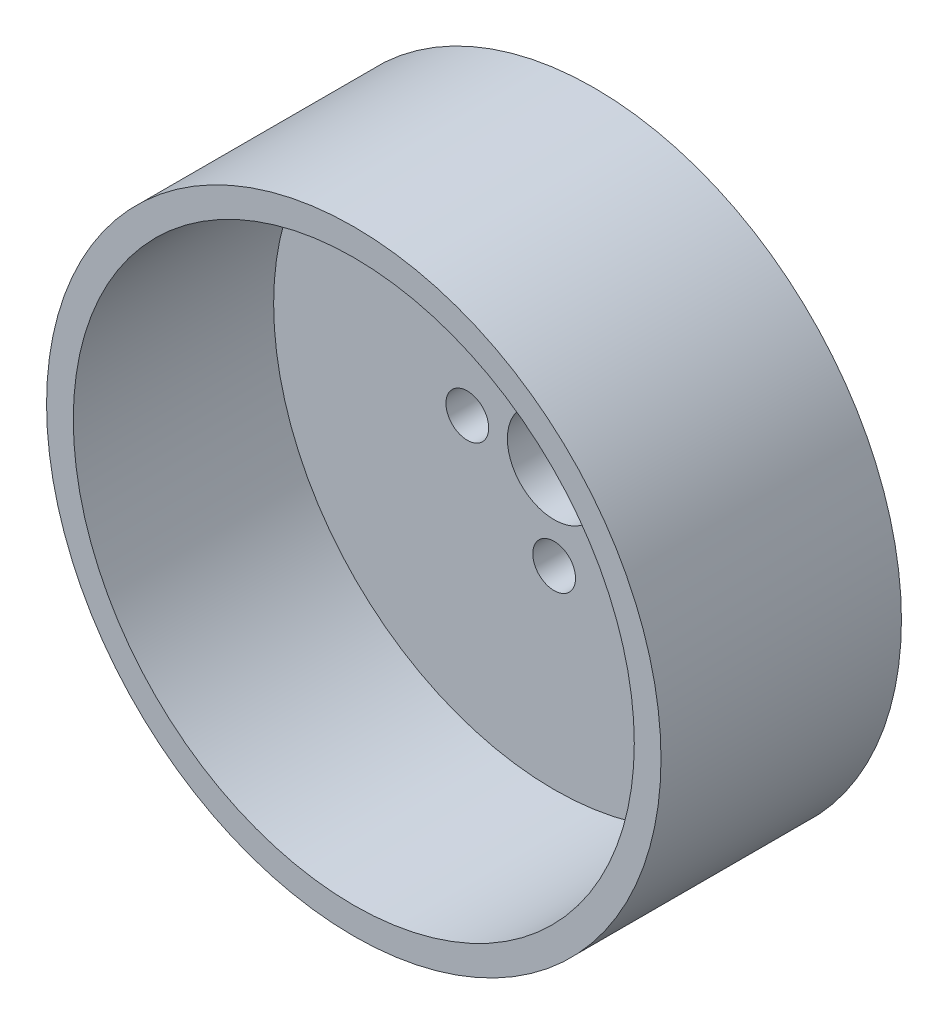
ISO-10303-21;
HEADER;
FILE_DESCRIPTION(('STEP AP214'),'2;1');
FILE_NAME('part.step','',(''),(''),'','','');
FILE_SCHEMA(('AUTOMOTIVE_DESIGN { 1 0 10303 214 1 1 1 1 }'));
ENDSEC;
DATA;
#1=APPLICATION_CONTEXT('core data for automotive mechanical design processes');
#2=APPLICATION_PROTOCOL_DEFINITION('international standard','automotive_design',2000,#1);
#3=PRODUCT_CONTEXT('',#1,'mechanical');
#4=PRODUCT('Part','Part','',(#3));
#5=PRODUCT_RELATED_PRODUCT_CATEGORY('part','',(#4));
#6=PRODUCT_DEFINITION_FORMATION('','',#4);
#7=PRODUCT_DEFINITION_CONTEXT('part definition',#1,'design');
#8=PRODUCT_DEFINITION('design','',#6,#7);
#9=PRODUCT_DEFINITION_SHAPE('','',#8);
#10=(LENGTH_UNIT() NAMED_UNIT(*) SI_UNIT(.MILLI.,.METRE.));
#11=(NAMED_UNIT(*) PLANE_ANGLE_UNIT() SI_UNIT($,.RADIAN.));
#12=(NAMED_UNIT(*) SI_UNIT($,.STERADIAN.) SOLID_ANGLE_UNIT());
#13=UNCERTAINTY_MEASURE_WITH_UNIT(LENGTH_MEASURE(1.E-05),#10,'distance_accuracy_value','');
#14=(GEOMETRIC_REPRESENTATION_CONTEXT(3) GLOBAL_UNCERTAINTY_ASSIGNED_CONTEXT((#13)) GLOBAL_UNIT_ASSIGNED_CONTEXT((#10,
#11,#12)) REPRESENTATION_CONTEXT('',''));
#15=CARTESIAN_POINT('',(0.,0.,0.));
#16=DIRECTION('',(0.,0.,1.));
#17=DIRECTION('',(1.,0.,0.));
#18=AXIS2_PLACEMENT_3D('',#15,#16,#17);
#19=CARTESIAN_POINT('',(0.,0.,0.));
#20=DIRECTION('',(0.,0.,-1.));
#21=DIRECTION('',(-1.,0.,0.));
#22=AXIS2_PLACEMENT_3D('',#19,#20,#21);
#23=CYLINDRICAL_SURFACE('',#22,3.5);
#24=CARTESIAN_POINT('',(0.,0.,0.));
#25=DIRECTION('',(0.,0.,-1.));
#26=DIRECTION('',(-1.,0.,0.));
#27=AXIS2_PLACEMENT_3D('',#24,#25,#26);
#28=CIRCLE('',#27,3.5);
#29=CARTESIAN_POINT('',(-3.5,0.,0.));
#30=VERTEX_POINT('',#29);
#31=EDGE_CURVE('E10',#30,#30,#28,.T.);
#32=ORIENTED_EDGE('',*,*,#31,.T.);
#33=EDGE_LOOP('',(#32));
#34=FACE_BOUND('',#33,.T.);
#35=CARTESIAN_POINT('',(0.,0.,3.));
#36=DIRECTION('',(0.,0.,-1.));
#37=DIRECTION('',(-1.,0.,0.));
#38=AXIS2_PLACEMENT_3D('',#35,#36,#37);
#39=CIRCLE('',#38,3.5);
#40=CARTESIAN_POINT('',(-3.5,0.,3.));
#41=VERTEX_POINT('',#40);
#42=EDGE_CURVE('E64',#41,#41,#39,.T.);
#43=ORIENTED_EDGE('',*,*,#42,.F.);
#44=EDGE_LOOP('',(#43));
#45=FACE_BOUND('',#44,.T.);
#46=ADVANCED_FACE('F37',(#34,#45),#23,.F.);
#47=CARTESIAN_POINT('',(-3.5,0.,0.));
#48=DIRECTION('',(0.,0.,-1.));
#49=DIRECTION('',(-1.,0.,0.));
#50=AXIS2_PLACEMENT_3D('',#47,#48,#49);
#51=PLANE('',#50);
#52=CARTESIAN_POINT('',(-6.5,0.,0.));
#53=DIRECTION('',(0.,0.,-1.));
#54=DIRECTION('',(-1.,0.,0.));
#55=AXIS2_PLACEMENT_3D('',#52,#53,#54);
#56=CIRCLE('',#55,1.6);
#57=CARTESIAN_POINT('',(-8.1,0.,0.));
#58=VERTEX_POINT('',#57);
#59=EDGE_CURVE('E57',#58,#58,#56,.T.);
#60=ORIENTED_EDGE('',*,*,#59,.F.);
#61=EDGE_LOOP('',(#60));
#62=FACE_BOUND('',#61,.T.);
#63=CARTESIAN_POINT('',(0.,-6.5,0.));
#64=DIRECTION('',(0.,0.,-1.));
#65=DIRECTION('',(-1.,0.,0.));
#66=AXIS2_PLACEMENT_3D('',#63,#64,#65);
#67=CIRCLE('',#66,1.6);
#68=CARTESIAN_POINT('',(-1.59999999999998,-6.5,0.));
#69=VERTEX_POINT('',#68);
#70=EDGE_CURVE('E115',#69,#69,#67,.T.);
#71=ORIENTED_EDGE('',*,*,#70,.F.);
#72=EDGE_LOOP('',(#71));
#73=FACE_BOUND('',#72,.T.);
#74=CARTESIAN_POINT('',(6.5,0.,0.));
#75=DIRECTION('',(0.,0.,-1.));
#76=DIRECTION('',(-1.,0.,0.));
#77=AXIS2_PLACEMENT_3D('',#74,#75,#76);
#78=CIRCLE('',#77,1.6);
#79=CARTESIAN_POINT('',(4.9,0.,0.));
#80=VERTEX_POINT('',#79);
#81=EDGE_CURVE('E119',#80,#80,#78,.T.);
#82=ORIENTED_EDGE('',*,*,#81,.F.);
#83=EDGE_LOOP('',(#82));
#84=FACE_BOUND('',#83,.T.);
#85=CARTESIAN_POINT('',(0.,6.5,0.));
#86=DIRECTION('',(0.,0.,-1.));
#87=DIRECTION('',(-1.,0.,0.));
#88=AXIS2_PLACEMENT_3D('',#85,#86,#87);
#89=CIRCLE('',#88,1.6);
#90=CARTESIAN_POINT('',(-1.60000000000007,6.5,0.));
#91=VERTEX_POINT('',#90);
#92=EDGE_CURVE('E76',#91,#91,#89,.T.);
#93=ORIENTED_EDGE('',*,*,#92,.F.);
#94=EDGE_LOOP('',(#93));
#95=FACE_BOUND('',#94,.T.);
#96=CARTESIAN_POINT('',(0.,0.,0.));
#97=DIRECTION('',(0.,0.,-1.));
#98=DIRECTION('',(-1.,0.,0.));
#99=AXIS2_PLACEMENT_3D('',#96,#97,#98);
#100=CIRCLE('',#99,23.);
#101=CARTESIAN_POINT('',(-23.,0.,0.));
#102=VERTEX_POINT('',#101);
#103=EDGE_CURVE('E44',#102,#102,#100,.T.);
#104=ORIENTED_EDGE('',*,*,#103,.T.);
#105=EDGE_LOOP('',(#104));
#106=FACE_BOUND('',#105,.T.);
#107=ORIENTED_EDGE('',*,*,#31,.F.);
#108=EDGE_LOOP('',(#107));
#109=FACE_BOUND('',#108,.T.);
#110=ADVANCED_FACE('F98',(#62,#73,#84,#95,#106,#109),#51,.T.);
#111=CARTESIAN_POINT('',(0.,0.,0.));
#112=DIRECTION('',(0.,0.,-1.));
#113=DIRECTION('',(-1.,0.,0.));
#114=AXIS2_PLACEMENT_3D('',#111,#112,#113);
#115=CYLINDRICAL_SURFACE('',#114,23.);
#116=CARTESIAN_POINT('',(0.,0.,18.));
#117=DIRECTION('',(0.,0.,-1.));
#118=DIRECTION('',(-1.,0.,0.));
#119=AXIS2_PLACEMENT_3D('',#116,#117,#118);
#120=CIRCLE('',#119,23.);
#121=CARTESIAN_POINT('',(-23.,0.,18.));
#122=VERTEX_POINT('',#121);
#123=EDGE_CURVE('E49',#122,#122,#120,.T.);
#124=ORIENTED_EDGE('',*,*,#123,.T.);
#125=EDGE_LOOP('',(#124));
#126=FACE_BOUND('',#125,.T.);
#127=ORIENTED_EDGE('',*,*,#103,.F.);
#128=EDGE_LOOP('',(#127));
#129=FACE_BOUND('',#128,.T.);
#130=ADVANCED_FACE('F83',(#126,#129),#115,.T.);
#131=CARTESIAN_POINT('',(-23.,0.,18.));
#132=DIRECTION('',(0.,0.,1.));
#133=DIRECTION('',(1.,0.,0.));
#134=AXIS2_PLACEMENT_3D('',#131,#132,#133);
#135=PLANE('',#134);
#136=CARTESIAN_POINT('',(0.,0.,18.));
#137=DIRECTION('',(0.,0.,-1.));
#138=DIRECTION('',(-1.,0.,0.));
#139=AXIS2_PLACEMENT_3D('',#136,#137,#138);
#140=CIRCLE('',#139,21.);
#141=CARTESIAN_POINT('',(-21.,0.,18.));
#142=VERTEX_POINT('',#141);
#143=EDGE_CURVE('E73',#142,#142,#140,.T.);
#144=ORIENTED_EDGE('',*,*,#143,.T.);
#145=EDGE_LOOP('',(#144));
#146=FACE_BOUND('',#145,.T.);
#147=ORIENTED_EDGE('',*,*,#123,.F.);
#148=EDGE_LOOP('',(#147));
#149=FACE_BOUND('',#148,.T.);
#150=ADVANCED_FACE('F86',(#146,#149),#135,.T.);
#151=CARTESIAN_POINT('',(0.,0.,0.));
#152=DIRECTION('',(0.,0.,-1.));
#153=DIRECTION('',(-1.,0.,0.));
#154=AXIS2_PLACEMENT_3D('',#151,#152,#153);
#155=CYLINDRICAL_SURFACE('',#154,21.);
#156=CARTESIAN_POINT('',(0.,0.,3.));
#157=DIRECTION('',(0.,0.,-1.));
#158=DIRECTION('',(-1.,0.,0.));
#159=AXIS2_PLACEMENT_3D('',#156,#157,#158);
#160=CIRCLE('',#159,21.);
#161=CARTESIAN_POINT('',(-21.,0.,3.));
#162=VERTEX_POINT('',#161);
#163=EDGE_CURVE('E68',#162,#162,#160,.T.);
#164=ORIENTED_EDGE('',*,*,#163,.T.);
#165=EDGE_LOOP('',(#164));
#166=FACE_BOUND('',#165,.T.);
#167=ORIENTED_EDGE('',*,*,#143,.F.);
#168=EDGE_LOOP('',(#167));
#169=FACE_BOUND('',#168,.T.);
#170=ADVANCED_FACE('F88',(#166,#169),#155,.F.);
#171=CARTESIAN_POINT('',(-21.,0.,3.));
#172=DIRECTION('',(0.,0.,1.));
#173=DIRECTION('',(1.,0.,0.));
#174=AXIS2_PLACEMENT_3D('',#171,#172,#173);
#175=PLANE('',#174);
#176=CARTESIAN_POINT('',(-6.5,0.,3.));
#177=DIRECTION('',(0.,0.,1.));
#178=DIRECTION('',(1.,0.,0.));
#179=AXIS2_PLACEMENT_3D('',#176,#177,#178);
#180=CIRCLE('',#179,1.6);
#181=CARTESIAN_POINT('',(-4.9,0.,3.));
#182=VERTEX_POINT('',#181);
#183=EDGE_CURVE('E40',#182,#182,#180,.T.);
#184=ORIENTED_EDGE('',*,*,#183,.F.);
#185=EDGE_LOOP('',(#184));
#186=FACE_BOUND('',#185,.T.);
#187=CARTESIAN_POINT('',(0.,-6.5,3.));
#188=DIRECTION('',(0.,0.,1.));
#189=DIRECTION('',(1.,0.,0.));
#190=AXIS2_PLACEMENT_3D('',#187,#188,#189);
#191=CIRCLE('',#190,1.6);
#192=CARTESIAN_POINT('',(1.60000000000002,-6.5,3.));
#193=VERTEX_POINT('',#192);
#194=EDGE_CURVE('E59',#193,#193,#191,.T.);
#195=ORIENTED_EDGE('',*,*,#194,.F.);
#196=EDGE_LOOP('',(#195));
#197=FACE_BOUND('',#196,.T.);
#198=CARTESIAN_POINT('',(6.5,0.,3.));
#199=DIRECTION('',(0.,0.,1.));
#200=DIRECTION('',(1.,0.,0.));
#201=AXIS2_PLACEMENT_3D('',#198,#199,#200);
#202=CIRCLE('',#201,1.6);
#203=CARTESIAN_POINT('',(8.1,0.,3.));
#204=VERTEX_POINT('',#203);
#205=EDGE_CURVE('E56',#204,#204,#202,.T.);
#206=ORIENTED_EDGE('',*,*,#205,.F.);
#207=EDGE_LOOP('',(#206));
#208=FACE_BOUND('',#207,.T.);
#209=CARTESIAN_POINT('',(0.,6.5,3.));
#210=DIRECTION('',(0.,0.,1.));
#211=DIRECTION('',(1.,0.,0.));
#212=AXIS2_PLACEMENT_3D('',#209,#210,#211);
#213=CIRCLE('',#212,1.6);
#214=CARTESIAN_POINT('',(1.59999999999993,6.5,3.));
#215=VERTEX_POINT('',#214);
#216=EDGE_CURVE('E53',#215,#215,#213,.T.);
#217=ORIENTED_EDGE('',*,*,#216,.F.);
#218=EDGE_LOOP('',(#217));
#219=FACE_BOUND('',#218,.T.);
#220=ORIENTED_EDGE('',*,*,#42,.T.);
#221=EDGE_LOOP('',(#220));
#222=FACE_BOUND('',#221,.T.);
#223=ORIENTED_EDGE('',*,*,#163,.F.);
#224=EDGE_LOOP('',(#223));
#225=FACE_BOUND('',#224,.T.);
#226=ADVANCED_FACE('F95',(#186,#197,#208,#219,#222,#225),#175,.T.);
#227=CARTESIAN_POINT('',(0.,6.5,10.));
#228=DIRECTION('',(0.,0.,-1.));
#229=DIRECTION('',(-1.,0.,0.));
#230=AXIS2_PLACEMENT_3D('',#227,#228,#229);
#231=CYLINDRICAL_SURFACE('',#230,1.6);
#232=ORIENTED_EDGE('',*,*,#216,.T.);
#233=EDGE_LOOP('',(#232));
#234=FACE_BOUND('',#233,.T.);
#235=ORIENTED_EDGE('',*,*,#92,.T.);
#236=EDGE_LOOP('',(#235));
#237=FACE_BOUND('',#236,.T.);
#238=ADVANCED_FACE('F142',(#234,#237),#231,.F.);
#239=CARTESIAN_POINT('',(6.5,0.,10.));
#240=DIRECTION('',(0.,0.,-1.));
#241=DIRECTION('',(-1.,0.,0.));
#242=AXIS2_PLACEMENT_3D('',#239,#240,#241);
#243=CYLINDRICAL_SURFACE('',#242,1.6);
#244=ORIENTED_EDGE('',*,*,#205,.T.);
#245=EDGE_LOOP('',(#244));
#246=FACE_BOUND('',#245,.T.);
#247=ORIENTED_EDGE('',*,*,#81,.T.);
#248=EDGE_LOOP('',(#247));
#249=FACE_BOUND('',#248,.T.);
#250=ADVANCED_FACE('F137',(#246,#249),#243,.F.);
#251=CARTESIAN_POINT('',(0.,-6.5,10.));
#252=DIRECTION('',(0.,0.,-1.));
#253=DIRECTION('',(-1.,0.,0.));
#254=AXIS2_PLACEMENT_3D('',#251,#252,#253);
#255=CYLINDRICAL_SURFACE('',#254,1.6);
#256=ORIENTED_EDGE('',*,*,#194,.T.);
#257=EDGE_LOOP('',(#256));
#258=FACE_BOUND('',#257,.T.);
#259=ORIENTED_EDGE('',*,*,#70,.T.);
#260=EDGE_LOOP('',(#259));
#261=FACE_BOUND('',#260,.T.);
#262=ADVANCED_FACE('F132',(#258,#261),#255,.F.);
#263=CARTESIAN_POINT('',(-6.5,0.,10.));
#264=DIRECTION('',(0.,0.,-1.));
#265=DIRECTION('',(-1.,0.,0.));
#266=AXIS2_PLACEMENT_3D('',#263,#264,#265);
#267=CYLINDRICAL_SURFACE('',#266,1.6);
#268=ORIENTED_EDGE('',*,*,#183,.T.);
#269=EDGE_LOOP('',(#268));
#270=FACE_BOUND('',#269,.T.);
#271=ORIENTED_EDGE('',*,*,#59,.T.);
#272=EDGE_LOOP('',(#271));
#273=FACE_BOUND('',#272,.T.);
#274=ADVANCED_FACE('F130',(#270,#273),#267,.F.);
#275=CLOSED_SHELL('',(#46,#110,#130,#150,#170,#226,#238,#250,#262,#274));
#276=MANIFOLD_SOLID_BREP('B2',#275);
#277=ADVANCED_BREP_SHAPE_REPRESENTATION('',(#18,#276),#14);
#278=SHAPE_DEFINITION_REPRESENTATION(#9,#277);
ENDSEC;
END-ISO-10303-21;
